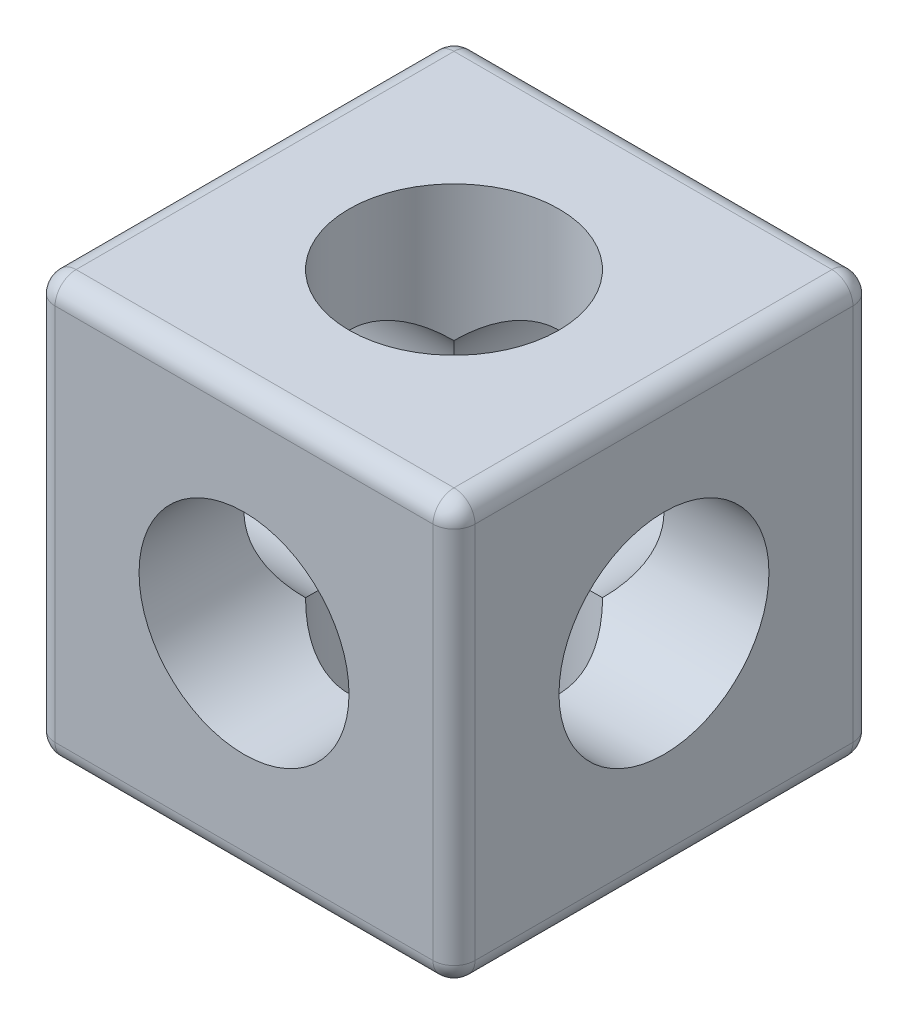
ISO-10303-21;
HEADER;
FILE_DESCRIPTION(('STEP AP214'),'2;1');
FILE_NAME('part.step','',(''),(''),'','','');
FILE_SCHEMA(('AUTOMOTIVE_DESIGN { 1 0 10303 214 1 1 1 1 }'));
ENDSEC;
DATA;
#1=APPLICATION_CONTEXT('core data for automotive mechanical design processes');
#2=APPLICATION_PROTOCOL_DEFINITION('international standard','automotive_design',2000,#1);
#3=PRODUCT_CONTEXT('',#1,'mechanical');
#4=PRODUCT('Part','Part','',(#3));
#5=PRODUCT_RELATED_PRODUCT_CATEGORY('part','',(#4));
#6=PRODUCT_DEFINITION_FORMATION('','',#4);
#7=PRODUCT_DEFINITION_CONTEXT('part definition',#1,'design');
#8=PRODUCT_DEFINITION('design','',#6,#7);
#9=PRODUCT_DEFINITION_SHAPE('','',#8);
#10=(LENGTH_UNIT() NAMED_UNIT(*) SI_UNIT(.MILLI.,.METRE.));
#11=(NAMED_UNIT(*) PLANE_ANGLE_UNIT() SI_UNIT($,.RADIAN.));
#12=(NAMED_UNIT(*) SI_UNIT($,.STERADIAN.) SOLID_ANGLE_UNIT());
#13=UNCERTAINTY_MEASURE_WITH_UNIT(LENGTH_MEASURE(1.E-05),#10,'distance_accuracy_value','');
#14=(GEOMETRIC_REPRESENTATION_CONTEXT(3) GLOBAL_UNCERTAINTY_ASSIGNED_CONTEXT((#13)) GLOBAL_UNIT_ASSIGNED_CONTEXT((#10,
#11,#12)) REPRESENTATION_CONTEXT('',''));
#15=CARTESIAN_POINT('',(0.,0.,0.));
#16=DIRECTION('',(0.,0.,1.));
#17=DIRECTION('',(1.,0.,0.));
#18=AXIS2_PLACEMENT_3D('',#15,#16,#17);
#19=CARTESIAN_POINT('',(0.,-2.001,2.));
#20=DIRECTION('',(0.,1.,0.));
#21=DIRECTION('',(-1.,0.,0.));
#22=AXIS2_PLACEMENT_3D('',#19,#20,#21);
#23=CYLINDRICAL_SURFACE('',#22,1.);
#24=CARTESIAN_POINT('',(0.,2.,2.));
#25=DIRECTION('',(0.,1.,0.));
#26=DIRECTION('',(-1.,0.,0.));
#27=AXIS2_PLACEMENT_3D('',#24,#25,#26);
#28=CIRCLE('',#27,1.);
#29=CARTESIAN_POINT('',(-1.,2.,2.));
#30=VERTEX_POINT('',#29);
#31=EDGE_CURVE('E322',#30,#30,#28,.T.);
#32=ORIENTED_EDGE('',*,*,#31,.T.);
#33=EDGE_LOOP('',(#32));
#34=FACE_BOUND('',#33,.T.);
#35=CARTESIAN_POINT('',(0.,0.,2.));
#36=DIRECTION('',(0.,0.707106781186547,-0.707106781186547));
#37=DIRECTION('',(0.,0.707106781186547,0.707106781186547));
#38=AXIS2_PLACEMENT_3D('',#35,#36,#37);
#39=ELLIPSE('',#38,1.41421356237309,1.);
#40=CARTESIAN_POINT('',(0.707106781186548,0.707106781186547,2.70710678118655));
#41=VERTEX_POINT('',#40);
#42=CARTESIAN_POINT('',(-0.707106781186547,0.707106781186547,2.70710678118655));
#43=VERTEX_POINT('',#42);
#44=EDGE_CURVE('E167',#41,#43,#39,.F.);
#45=ORIENTED_EDGE('',*,*,#44,.T.);
#46=CARTESIAN_POINT('',(0.,0.,2.));
#47=DIRECTION('',(0.707106781186547,0.707106781186548,0.));
#48=DIRECTION('',(-0.707106781186548,0.707106781186547,0.));
#49=AXIS2_PLACEMENT_3D('',#46,#47,#48);
#50=ELLIPSE('',#49,1.4142135623731,1.);
#51=CARTESIAN_POINT('',(-0.707106781186547,0.707106781186547,1.29289321881345));
#52=VERTEX_POINT('',#51);
#53=EDGE_CURVE('E151',#43,#52,#50,.F.);
#54=ORIENTED_EDGE('',*,*,#53,.T.);
#55=CARTESIAN_POINT('',(0.,0.,2.));
#56=DIRECTION('',(0.,0.707106781186547,0.707106781186547));
#57=DIRECTION('',(0.,0.707106781186547,-0.707106781186547));
#58=AXIS2_PLACEMENT_3D('',#55,#56,#57);
#59=ELLIPSE('',#58,1.41421356237309,1.);
#60=CARTESIAN_POINT('',(0.707106781186548,0.707106781186547,1.29289321881345));
#61=VERTEX_POINT('',#60);
#62=EDGE_CURVE('E160',#52,#61,#59,.F.);
#63=ORIENTED_EDGE('',*,*,#62,.T.);
#64=CARTESIAN_POINT('',(0.,0.,2.));
#65=DIRECTION('',(-0.707106781186548,0.707106781186547,0.));
#66=DIRECTION('',(0.707106781186547,0.707106781186548,0.));
#67=AXIS2_PLACEMENT_3D('',#64,#65,#66);
#68=ELLIPSE('',#67,1.41421356237309,1.);
#69=EDGE_CURVE('E313',#61,#41,#68,.F.);
#70=ORIENTED_EDGE('',*,*,#69,.T.);
#71=EDGE_LOOP('',(#45,#54,#63,#70));
#72=FACE_BOUND('',#71,.T.);
#73=ADVANCED_FACE('F33',(#34,#72),#23,.F.);
#74=CARTESIAN_POINT('',(-2.,2.,4.));
#75=DIRECTION('',(1.,0.,0.));
#76=DIRECTION('',(0.,0.,-1.));
#77=AXIS2_PLACEMENT_3D('',#74,#75,#76);
#78=PLANE('',#77);
#79=DIRECTION('',(0.,0.,-1.));
#80=VECTOR('',#79,1.);
#81=CARTESIAN_POINT('',(-2.,-1.8,4.));
#82=LINE('',#81,#80);
#83=CARTESIAN_POINT('',(-2.,-1.8,0.2));
#84=VERTEX_POINT('',#83);
#85=CARTESIAN_POINT('',(-2.,-1.8,3.8));
#86=VERTEX_POINT('',#85);
#87=EDGE_CURVE('E220',#84,#86,#82,.F.);
#88=ORIENTED_EDGE('',*,*,#87,.T.);
#89=DIRECTION('',(0.,-1.,0.));
#90=VECTOR('',#89,1.);
#91=CARTESIAN_POINT('',(-2.,2.,3.8));
#92=LINE('',#91,#90);
#93=CARTESIAN_POINT('',(-2.,1.8,3.8));
#94=VERTEX_POINT('',#93);
#95=EDGE_CURVE('E222',#86,#94,#92,.F.);
#96=ORIENTED_EDGE('',*,*,#95,.T.);
#97=DIRECTION('',(0.,0.,-1.));
#98=VECTOR('',#97,1.);
#99=CARTESIAN_POINT('',(-2.,1.8,4.));
#100=LINE('',#99,#98);
#101=CARTESIAN_POINT('',(-2.,1.8,0.2));
#102=VERTEX_POINT('',#101);
#103=EDGE_CURVE('E216',#94,#102,#100,.T.);
#104=ORIENTED_EDGE('',*,*,#103,.T.);
#105=DIRECTION('',(0.,-1.,0.));
#106=VECTOR('',#105,1.);
#107=CARTESIAN_POINT('',(-2.,-2.,0.2));
#108=LINE('',#107,#106);
#109=EDGE_CURVE('E218',#102,#84,#108,.T.);
#110=ORIENTED_EDGE('',*,*,#109,.T.);
#111=EDGE_LOOP('',(#88,#96,#104,#110));
#112=FACE_BOUND('',#111,.T.);
#113=CARTESIAN_POINT('',(-2.,0.,2.));
#114=DIRECTION('',(1.,0.,0.));
#115=DIRECTION('',(0.,0.,-1.));
#116=AXIS2_PLACEMENT_3D('',#113,#114,#115);
#117=CIRCLE('',#116,1.);
#118=CARTESIAN_POINT('',(-2.,0.,1.));
#119=VERTEX_POINT('',#118);
#120=EDGE_CURVE('E301',#119,#119,#117,.T.);
#121=ORIENTED_EDGE('',*,*,#120,.T.);
#122=EDGE_LOOP('',(#121));
#123=FACE_BOUND('',#122,.T.);
#124=ADVANCED_FACE('F350',(#112,#123),#78,.F.);
#125=CARTESIAN_POINT('',(2.,-2.,4.));
#126=DIRECTION('',(0.,1.,0.));
#127=DIRECTION('',(-1.,0.,0.));
#128=AXIS2_PLACEMENT_3D('',#125,#126,#127);
#129=PLANE('',#128);
#130=DIRECTION('',(0.,0.,-1.));
#131=VECTOR('',#130,1.);
#132=CARTESIAN_POINT('',(1.8,-2.,4.));
#133=LINE('',#132,#131);
#134=CARTESIAN_POINT('',(1.8,-2.,0.2));
#135=VERTEX_POINT('',#134);
#136=CARTESIAN_POINT('',(1.8,-2.,3.8));
#137=VERTEX_POINT('',#136);
#138=EDGE_CURVE('E193',#135,#137,#133,.F.);
#139=ORIENTED_EDGE('',*,*,#138,.T.);
#140=DIRECTION('',(1.,0.,0.));
#141=VECTOR('',#140,1.);
#142=CARTESIAN_POINT('',(2.,-2.,3.8));
#143=LINE('',#142,#141);
#144=CARTESIAN_POINT('',(-1.8,-2.,3.8));
#145=VERTEX_POINT('',#144);
#146=EDGE_CURVE('E195',#137,#145,#143,.F.);
#147=ORIENTED_EDGE('',*,*,#146,.T.);
#148=DIRECTION('',(0.,0.,-1.));
#149=VECTOR('',#148,1.);
#150=CARTESIAN_POINT('',(-1.8,-2.,4.));
#151=LINE('',#150,#149);
#152=CARTESIAN_POINT('',(-1.8,-2.,0.2));
#153=VERTEX_POINT('',#152);
#154=EDGE_CURVE('E189',#145,#153,#151,.T.);
#155=ORIENTED_EDGE('',*,*,#154,.T.);
#156=DIRECTION('',(1.,0.,0.));
#157=VECTOR('',#156,1.);
#158=CARTESIAN_POINT('',(2.,-2.,0.2));
#159=LINE('',#158,#157);
#160=EDGE_CURVE('E191',#153,#135,#159,.T.);
#161=ORIENTED_EDGE('',*,*,#160,.T.);
#162=EDGE_LOOP('',(#139,#147,#155,#161));
#163=FACE_BOUND('',#162,.T.);
#164=CARTESIAN_POINT('',(0.,-2.,2.));
#165=DIRECTION('',(0.,1.,0.));
#166=DIRECTION('',(-1.,0.,0.));
#167=AXIS2_PLACEMENT_3D('',#164,#165,#166);
#168=CIRCLE('',#167,1.);
#169=CARTESIAN_POINT('',(-0.999999999999999,-2.,2.));
#170=VERTEX_POINT('',#169);
#171=EDGE_CURVE('E327',#170,#170,#168,.F.);
#172=ORIENTED_EDGE('',*,*,#171,.F.);
#173=EDGE_LOOP('',(#172));
#174=FACE_BOUND('',#173,.T.);
#175=ADVANCED_FACE('F355',(#163,#174),#129,.F.);
#176=CARTESIAN_POINT('',(2.,2.,4.));
#177=DIRECTION('',(-1.,0.,0.));
#178=DIRECTION('',(0.,0.,1.));
#179=AXIS2_PLACEMENT_3D('',#176,#177,#178);
#180=PLANE('',#179);
#181=DIRECTION('',(0.,0.,-1.));
#182=VECTOR('',#181,1.);
#183=CARTESIAN_POINT('',(2.,1.8,4.));
#184=LINE('',#183,#182);
#185=CARTESIAN_POINT('',(2.,1.8,0.2));
#186=VERTEX_POINT('',#185);
#187=CARTESIAN_POINT('',(2.,1.8,3.8));
#188=VERTEX_POINT('',#187);
#189=EDGE_CURVE('E200',#186,#188,#184,.F.);
#190=ORIENTED_EDGE('',*,*,#189,.T.);
#191=DIRECTION('',(0.,1.,0.));
#192=VECTOR('',#191,1.);
#193=CARTESIAN_POINT('',(2.,2.,3.8));
#194=LINE('',#193,#192);
#195=CARTESIAN_POINT('',(2.,-1.8,3.8));
#196=VERTEX_POINT('',#195);
#197=EDGE_CURVE('E204',#188,#196,#194,.F.);
#198=ORIENTED_EDGE('',*,*,#197,.T.);
#199=DIRECTION('',(0.,0.,-1.));
#200=VECTOR('',#199,1.);
#201=CARTESIAN_POINT('',(2.,-1.8,4.));
#202=LINE('',#201,#200);
#203=CARTESIAN_POINT('',(2.,-1.8,0.2));
#204=VERTEX_POINT('',#203);
#205=EDGE_CURVE('E202',#196,#204,#202,.T.);
#206=ORIENTED_EDGE('',*,*,#205,.T.);
#207=DIRECTION('',(0.,1.,0.));
#208=VECTOR('',#207,1.);
#209=CARTESIAN_POINT('',(2.,2.,0.2));
#210=LINE('',#209,#208);
#211=EDGE_CURVE('E198',#204,#186,#210,.T.);
#212=ORIENTED_EDGE('',*,*,#211,.T.);
#213=EDGE_LOOP('',(#190,#198,#206,#212));
#214=FACE_BOUND('',#213,.T.);
#215=CARTESIAN_POINT('',(2.,0.,2.));
#216=DIRECTION('',(1.,0.,0.));
#217=DIRECTION('',(0.,0.,-1.));
#218=AXIS2_PLACEMENT_3D('',#215,#216,#217);
#219=CIRCLE('',#218,1.);
#220=CARTESIAN_POINT('',(2.,0.,1.));
#221=VERTEX_POINT('',#220);
#222=EDGE_CURVE('E295',#221,#221,#219,.T.);
#223=ORIENTED_EDGE('',*,*,#222,.F.);
#224=EDGE_LOOP('',(#223));
#225=FACE_BOUND('',#224,.T.);
#226=ADVANCED_FACE('F368',(#214,#225),#180,.F.);
#227=CARTESIAN_POINT('',(2.,2.,4.));
#228=DIRECTION('',(0.,-1.,0.));
#229=DIRECTION('',(1.,0.,0.));
#230=AXIS2_PLACEMENT_3D('',#227,#228,#229);
#231=PLANE('',#230);
#232=DIRECTION('',(-1.,0.,0.));
#233=VECTOR('',#232,1.);
#234=CARTESIAN_POINT('',(2.,2.,3.8));
#235=LINE('',#234,#233);
#236=CARTESIAN_POINT('',(-1.8,2.,3.8));
#237=VERTEX_POINT('',#236);
#238=CARTESIAN_POINT('',(1.8,2.,3.8));
#239=VERTEX_POINT('',#238);
#240=EDGE_CURVE('E211',#237,#239,#235,.F.);
#241=ORIENTED_EDGE('',*,*,#240,.T.);
#242=DIRECTION('',(0.,0.,-1.));
#243=VECTOR('',#242,1.);
#244=CARTESIAN_POINT('',(1.8,2.,4.));
#245=LINE('',#244,#243);
#246=CARTESIAN_POINT('',(1.8,2.,0.2));
#247=VERTEX_POINT('',#246);
#248=EDGE_CURVE('E213',#239,#247,#245,.T.);
#249=ORIENTED_EDGE('',*,*,#248,.T.);
#250=DIRECTION('',(-1.,0.,0.));
#251=VECTOR('',#250,1.);
#252=CARTESIAN_POINT('',(-2.,2.,0.2));
#253=LINE('',#252,#251);
#254=CARTESIAN_POINT('',(-1.8,2.,0.2));
#255=VERTEX_POINT('',#254);
#256=EDGE_CURVE('E207',#247,#255,#253,.T.);
#257=ORIENTED_EDGE('',*,*,#256,.T.);
#258=DIRECTION('',(0.,0.,-1.));
#259=VECTOR('',#258,1.);
#260=CARTESIAN_POINT('',(-1.8,2.,4.));
#261=LINE('',#260,#259);
#262=EDGE_CURVE('E209',#255,#237,#261,.F.);
#263=ORIENTED_EDGE('',*,*,#262,.T.);
#264=EDGE_LOOP('',(#241,#249,#257,#263));
#265=FACE_BOUND('',#264,.T.);
#266=ORIENTED_EDGE('',*,*,#31,.F.);
#267=EDGE_LOOP('',(#266));
#268=FACE_BOUND('',#267,.T.);
#269=ADVANCED_FACE('F362',(#265,#268),#231,.F.);
#270=CARTESIAN_POINT('',(0.,0.,4.));
#271=DIRECTION('',(0.,0.,-1.));
#272=DIRECTION('',(-1.,0.,0.));
#273=AXIS2_PLACEMENT_3D('',#270,#271,#272);
#274=PLANE('',#273);
#275=DIRECTION('',(0.,-1.,0.));
#276=VECTOR('',#275,1.);
#277=CARTESIAN_POINT('',(-1.8,0.,4.));
#278=LINE('',#277,#276);
#279=CARTESIAN_POINT('',(-1.8,1.8,4.));
#280=VERTEX_POINT('',#279);
#281=CARTESIAN_POINT('',(-1.8,-1.8,4.));
#282=VERTEX_POINT('',#281);
#283=EDGE_CURVE('E180',#280,#282,#278,.T.);
#284=ORIENTED_EDGE('',*,*,#283,.T.);
#285=DIRECTION('',(1.,0.,0.));
#286=VECTOR('',#285,1.);
#287=CARTESIAN_POINT('',(0.,-1.8,4.));
#288=LINE('',#287,#286);
#289=CARTESIAN_POINT('',(1.8,-1.8,4.));
#290=VERTEX_POINT('',#289);
#291=EDGE_CURVE('E186',#282,#290,#288,.T.);
#292=ORIENTED_EDGE('',*,*,#291,.T.);
#293=DIRECTION('',(0.,1.,0.));
#294=VECTOR('',#293,1.);
#295=CARTESIAN_POINT('',(1.8,0.,4.));
#296=LINE('',#295,#294);
#297=CARTESIAN_POINT('',(1.8,1.8,4.));
#298=VERTEX_POINT('',#297);
#299=EDGE_CURVE('E184',#290,#298,#296,.T.);
#300=ORIENTED_EDGE('',*,*,#299,.T.);
#301=DIRECTION('',(-1.,0.,0.));
#302=VECTOR('',#301,1.);
#303=CARTESIAN_POINT('',(0.,1.8,4.));
#304=LINE('',#303,#302);
#305=EDGE_CURVE('E182',#298,#280,#304,.T.);
#306=ORIENTED_EDGE('',*,*,#305,.T.);
#307=EDGE_LOOP('',(#284,#292,#300,#306));
#308=FACE_BOUND('',#307,.T.);
#309=CARTESIAN_POINT('',(0.,0.,4.));
#310=DIRECTION('',(0.,0.,1.));
#311=DIRECTION('',(1.,0.,0.));
#312=AXIS2_PLACEMENT_3D('',#309,#310,#311);
#313=CIRCLE('',#312,1.);
#314=CARTESIAN_POINT('',(1.,0.,4.));
#315=VERTEX_POINT('',#314);
#316=EDGE_CURVE('E318',#315,#315,#313,.T.);
#317=ORIENTED_EDGE('',*,*,#316,.F.);
#318=EDGE_LOOP('',(#317));
#319=FACE_BOUND('',#318,.T.);
#320=ADVANCED_FACE('F359',(#308,#319),#274,.F.);
#321=CARTESIAN_POINT('',(0.,0.,0.));
#322=DIRECTION('',(0.,0.,-1.));
#323=DIRECTION('',(-1.,0.,0.));
#324=AXIS2_PLACEMENT_3D('',#321,#322,#323);
#325=PLANE('',#324);
#326=DIRECTION('',(-1.,0.,0.));
#327=VECTOR('',#326,1.);
#328=CARTESIAN_POINT('',(2.,1.8,0.));
#329=LINE('',#328,#327);
#330=CARTESIAN_POINT('',(-1.8,1.8,0.));
#331=VERTEX_POINT('',#330);
#332=CARTESIAN_POINT('',(1.8,1.8,0.));
#333=VERTEX_POINT('',#332);
#334=EDGE_CURVE('E225',#331,#333,#329,.F.);
#335=ORIENTED_EDGE('',*,*,#334,.T.);
#336=DIRECTION('',(0.,1.,0.));
#337=VECTOR('',#336,1.);
#338=CARTESIAN_POINT('',(1.8,-2.,0.));
#339=LINE('',#338,#337);
#340=CARTESIAN_POINT('',(1.8,-1.8,0.));
#341=VERTEX_POINT('',#340);
#342=EDGE_CURVE('E11',#333,#341,#339,.F.);
#343=ORIENTED_EDGE('',*,*,#342,.T.);
#344=DIRECTION('',(1.,0.,0.));
#345=VECTOR('',#344,1.);
#346=CARTESIAN_POINT('',(-2.,-1.8,0.));
#347=LINE('',#346,#345);
#348=CARTESIAN_POINT('',(-1.8,-1.8,0.));
#349=VERTEX_POINT('',#348);
#350=EDGE_CURVE('E42',#341,#349,#347,.F.);
#351=ORIENTED_EDGE('',*,*,#350,.T.);
#352=DIRECTION('',(0.,-1.,0.));
#353=VECTOR('',#352,1.);
#354=CARTESIAN_POINT('',(-1.8,2.,0.));
#355=LINE('',#354,#353);
#356=EDGE_CURVE('E227',#349,#331,#355,.F.);
#357=ORIENTED_EDGE('',*,*,#356,.T.);
#358=EDGE_LOOP('',(#335,#343,#351,#357));
#359=FACE_BOUND('',#358,.T.);
#360=CARTESIAN_POINT('',(0.,0.,0.));
#361=DIRECTION('',(0.,0.,1.));
#362=DIRECTION('',(1.,0.,0.));
#363=AXIS2_PLACEMENT_3D('',#360,#361,#362);
#364=CIRCLE('',#363,1.);
#365=CARTESIAN_POINT('',(1.,0.,0.));
#366=VERTEX_POINT('',#365);
#367=EDGE_CURVE('E319',#366,#366,#364,.T.);
#368=ORIENTED_EDGE('',*,*,#367,.T.);
#369=EDGE_LOOP('',(#368));
#370=FACE_BOUND('',#369,.T.);
#371=ADVANCED_FACE('F346',(#359,#370),#325,.T.);
#372=CARTESIAN_POINT('',(0.,0.,2.));
#373=DIRECTION('',(0.,0.707106781186547,0.707106781186547));
#374=DIRECTION('',(0.,0.707106781186547,-0.707106781186547));
#375=AXIS2_PLACEMENT_3D('',#372,#373,#374);
#376=ELLIPSE('',#375,1.41421356237309,1.);
#377=CARTESIAN_POINT('',(-0.707106781186547,-0.707106781186548,2.70710678118655));
#378=VERTEX_POINT('',#377);
#379=CARTESIAN_POINT('',(0.707106781186548,-0.707106781186547,2.70710678118655));
#380=VERTEX_POINT('',#379);
#381=EDGE_CURVE('E172',#378,#380,#376,.T.);
#382=ORIENTED_EDGE('',*,*,#381,.T.);
#383=CARTESIAN_POINT('',(0.,0.,2.));
#384=DIRECTION('',(0.707106781186547,0.707106781186548,0.));
#385=DIRECTION('',(-0.707106781186548,0.707106781186547,0.));
#386=AXIS2_PLACEMENT_3D('',#383,#384,#385);
#387=ELLIPSE('',#386,1.4142135623731,1.);
#388=CARTESIAN_POINT('',(0.707106781186548,-0.707106781186547,1.29289321881345));
#389=VERTEX_POINT('',#388);
#390=EDGE_CURVE('E310',#380,#389,#387,.T.);
#391=ORIENTED_EDGE('',*,*,#390,.T.);
#392=CARTESIAN_POINT('',(0.,0.,2.));
#393=DIRECTION('',(0.,0.707106781186547,-0.707106781186547));
#394=DIRECTION('',(0.,0.707106781186547,0.707106781186547));
#395=AXIS2_PLACEMENT_3D('',#392,#393,#394);
#396=ELLIPSE('',#395,1.41421356237309,1.);
#397=CARTESIAN_POINT('',(-0.707106781186547,-0.707106781186547,1.29289321881345));
#398=VERTEX_POINT('',#397);
#399=EDGE_CURVE('E175',#389,#398,#396,.T.);
#400=ORIENTED_EDGE('',*,*,#399,.T.);
#401=CARTESIAN_POINT('',(0.,0.,2.));
#402=DIRECTION('',(-0.707106781186548,0.707106781186547,0.));
#403=DIRECTION('',(0.707106781186547,0.707106781186548,0.));
#404=AXIS2_PLACEMENT_3D('',#401,#402,#403);
#405=ELLIPSE('',#404,1.41421356237309,1.);
#406=EDGE_CURVE('E154',#398,#378,#405,.T.);
#407=ORIENTED_EDGE('',*,*,#406,.T.);
#408=EDGE_LOOP('',(#382,#391,#400,#407));
#409=FACE_BOUND('',#408,.T.);
#410=ORIENTED_EDGE('',*,*,#171,.T.);
#411=EDGE_LOOP('',(#410));
#412=FACE_BOUND('',#411,.T.);
#413=ADVANCED_FACE('F331',(#409,#412),#23,.F.);
#414=CARTESIAN_POINT('',(0.,0.,0.));
#415=DIRECTION('',(0.,0.,1.));
#416=DIRECTION('',(1.,0.,0.));
#417=AXIS2_PLACEMENT_3D('',#414,#415,#416);
#418=CYLINDRICAL_SURFACE('',#417,1.);
#419=ORIENTED_EDGE('',*,*,#316,.T.);
#420=EDGE_LOOP('',(#419));
#421=FACE_BOUND('',#420,.T.);
#422=ORIENTED_EDGE('',*,*,#381,.F.);
#423=CARTESIAN_POINT('',(0.,0.,2.));
#424=DIRECTION('',(0.707106781186547,0.,0.707106781186547));
#425=DIRECTION('',(-0.707106781186547,0.,0.707106781186547));
#426=AXIS2_PLACEMENT_3D('',#423,#424,#425);
#427=ELLIPSE('',#426,1.41421356237309,1.);
#428=EDGE_CURVE('E168',#378,#43,#427,.F.);
#429=ORIENTED_EDGE('',*,*,#428,.T.);
#430=ORIENTED_EDGE('',*,*,#44,.F.);
#431=CARTESIAN_POINT('',(0.,0.,2.));
#432=DIRECTION('',(-0.707106781186547,0.,0.707106781186547));
#433=DIRECTION('',(0.707106781186547,0.,0.707106781186547));
#434=AXIS2_PLACEMENT_3D('',#431,#432,#433);
#435=ELLIPSE('',#434,1.41421356237309,1.);
#436=EDGE_CURVE('E315',#41,#380,#435,.F.);
#437=ORIENTED_EDGE('',*,*,#436,.T.);
#438=EDGE_LOOP('',(#422,#429,#430,#437));
#439=FACE_BOUND('',#438,.T.);
#440=ADVANCED_FACE('F337',(#421,#439),#418,.F.);
#441=ORIENTED_EDGE('',*,*,#367,.F.);
#442=EDGE_LOOP('',(#441));
#443=FACE_BOUND('',#442,.T.);
#444=ORIENTED_EDGE('',*,*,#399,.F.);
#445=CARTESIAN_POINT('',(0.,0.,2.));
#446=DIRECTION('',(0.707106781186547,0.,0.707106781186547));
#447=DIRECTION('',(-0.707106781186547,0.,0.707106781186547));
#448=AXIS2_PLACEMENT_3D('',#445,#446,#447);
#449=ELLIPSE('',#448,1.41421356237309,1.);
#450=EDGE_CURVE('E159',#389,#61,#449,.T.);
#451=ORIENTED_EDGE('',*,*,#450,.T.);
#452=ORIENTED_EDGE('',*,*,#62,.F.);
#453=CARTESIAN_POINT('',(0.,0.,2.));
#454=DIRECTION('',(-0.707106781186547,0.,0.707106781186547));
#455=DIRECTION('',(0.707106781186547,0.,0.707106781186547));
#456=AXIS2_PLACEMENT_3D('',#453,#454,#455);
#457=ELLIPSE('',#456,1.41421356237309,1.);
#458=EDGE_CURVE('E148',#52,#398,#457,.T.);
#459=ORIENTED_EDGE('',*,*,#458,.T.);
#460=EDGE_LOOP('',(#444,#451,#452,#459));
#461=FACE_BOUND('',#460,.T.);
#462=ADVANCED_FACE('F171',(#443,#461),#418,.F.);
#463=CARTESIAN_POINT('',(-2.,0.,2.));
#464=DIRECTION('',(1.,0.,0.));
#465=DIRECTION('',(0.,0.,-1.));
#466=AXIS2_PLACEMENT_3D('',#463,#464,#465);
#467=CYLINDRICAL_SURFACE('',#466,1.);
#468=ORIENTED_EDGE('',*,*,#120,.F.);
#469=EDGE_LOOP('',(#468));
#470=FACE_BOUND('',#469,.T.);
#471=ORIENTED_EDGE('',*,*,#406,.F.);
#472=ORIENTED_EDGE('',*,*,#458,.F.);
#473=ORIENTED_EDGE('',*,*,#53,.F.);
#474=ORIENTED_EDGE('',*,*,#428,.F.);
#475=EDGE_LOOP('',(#471,#472,#473,#474));
#476=FACE_BOUND('',#475,.T.);
#477=ADVANCED_FACE('F150',(#470,#476),#467,.F.);
#478=ORIENTED_EDGE('',*,*,#222,.T.);
#479=EDGE_LOOP('',(#478));
#480=FACE_BOUND('',#479,.T.);
#481=ORIENTED_EDGE('',*,*,#69,.F.);
#482=ORIENTED_EDGE('',*,*,#450,.F.);
#483=ORIENTED_EDGE('',*,*,#390,.F.);
#484=ORIENTED_EDGE('',*,*,#436,.F.);
#485=EDGE_LOOP('',(#481,#482,#483,#484));
#486=FACE_BOUND('',#485,.T.);
#487=ADVANCED_FACE('F335',(#480,#486),#467,.F.);
#488=CARTESIAN_POINT('',(2.,1.8,0.2));
#489=DIRECTION('',(1.,0.,0.));
#490=DIRECTION('',(0.,1.,0.));
#491=AXIS2_PLACEMENT_3D('',#488,#489,#490);
#492=CYLINDRICAL_SURFACE('',#491,0.2);
#493=CARTESIAN_POINT('',(-1.8,1.8,0.2));
#494=DIRECTION('',(-1.,0.,0.));
#495=DIRECTION('',(0.,0.,1.));
#496=AXIS2_PLACEMENT_3D('',#493,#494,#495);
#497=CIRCLE('',#496,0.2);
#498=EDGE_CURVE('E37',#255,#331,#497,.T.);
#499=ORIENTED_EDGE('',*,*,#498,.F.);
#500=ORIENTED_EDGE('',*,*,#256,.F.);
#501=CARTESIAN_POINT('',(1.8,1.8,0.2));
#502=DIRECTION('',(1.,0.,0.));
#503=DIRECTION('',(0.,0.,-1.));
#504=AXIS2_PLACEMENT_3D('',#501,#502,#503);
#505=CIRCLE('',#504,0.2);
#506=EDGE_CURVE('E287',#333,#247,#505,.T.);
#507=ORIENTED_EDGE('',*,*,#506,.F.);
#508=ORIENTED_EDGE('',*,*,#334,.F.);
#509=EDGE_LOOP('',(#499,#500,#507,#508));
#510=FACE_BOUND('',#509,.T.);
#511=ADVANCED_FACE('F35',(#510),#492,.T.);
#512=CARTESIAN_POINT('',(-1.8,1.8,0.2));
#513=DIRECTION('',(0.,0.,1.));
#514=DIRECTION('',(1.,0.,0.));
#515=AXIS2_PLACEMENT_3D('',#512,#513,#514);
#516=SPHERICAL_SURFACE('',#515,0.2);
#517=CARTESIAN_POINT('',(-1.8,1.8,0.2));
#518=DIRECTION('',(0.,0.,-1.));
#519=DIRECTION('',(-1.,0.,0.));
#520=AXIS2_PLACEMENT_3D('',#517,#518,#519);
#521=CIRCLE('',#520,0.2);
#522=EDGE_CURVE('E282',#255,#102,#521,.F.);
#523=ORIENTED_EDGE('',*,*,#522,.F.);
#524=ORIENTED_EDGE('',*,*,#498,.T.);
#525=CARTESIAN_POINT('',(-1.8,1.8,0.2));
#526=DIRECTION('',(0.,1.,0.));
#527=DIRECTION('',(0.,0.,1.));
#528=AXIS2_PLACEMENT_3D('',#525,#526,#527);
#529=CIRCLE('',#528,0.2);
#530=EDGE_CURVE('E285',#102,#331,#529,.F.);
#531=ORIENTED_EDGE('',*,*,#530,.F.);
#532=EDGE_LOOP('',(#523,#524,#531));
#533=FACE_BOUND('',#532,.T.);
#534=ADVANCED_FACE('F445',(#533),#516,.T.);
#535=CARTESIAN_POINT('',(1.8,1.8,0.2));
#536=DIRECTION('',(0.,0.,1.));
#537=DIRECTION('',(1.,0.,0.));
#538=AXIS2_PLACEMENT_3D('',#535,#536,#537);
#539=SPHERICAL_SURFACE('',#538,0.2);
#540=CARTESIAN_POINT('',(1.8,1.8,0.2));
#541=DIRECTION('',(0.,1.,0.));
#542=DIRECTION('',(0.,0.,1.));
#543=AXIS2_PLACEMENT_3D('',#540,#541,#542);
#544=CIRCLE('',#543,0.2);
#545=EDGE_CURVE('E277',#333,#186,#544,.F.);
#546=ORIENTED_EDGE('',*,*,#545,.F.);
#547=ORIENTED_EDGE('',*,*,#506,.T.);
#548=CARTESIAN_POINT('',(1.8,1.8,0.2));
#549=DIRECTION('',(0.,0.,-1.));
#550=DIRECTION('',(-1.,0.,0.));
#551=AXIS2_PLACEMENT_3D('',#548,#549,#550);
#552=CIRCLE('',#551,0.2);
#553=EDGE_CURVE('E280',#186,#247,#552,.F.);
#554=ORIENTED_EDGE('',*,*,#553,.F.);
#555=EDGE_LOOP('',(#546,#547,#554));
#556=FACE_BOUND('',#555,.T.);
#557=ADVANCED_FACE('F442',(#556),#539,.T.);
#558=CARTESIAN_POINT('',(-1.8,2.,0.2));
#559=DIRECTION('',(0.,1.,0.));
#560=DIRECTION('',(0.,0.,1.));
#561=AXIS2_PLACEMENT_3D('',#558,#559,#560);
#562=CYLINDRICAL_SURFACE('',#561,0.2);
#563=ORIENTED_EDGE('',*,*,#530,.T.);
#564=ORIENTED_EDGE('',*,*,#356,.F.);
#565=CARTESIAN_POINT('',(-1.8,-1.8,0.2));
#566=DIRECTION('',(0.,-1.,0.));
#567=DIRECTION('',(0.,0.,-1.));
#568=AXIS2_PLACEMENT_3D('',#565,#566,#567);
#569=CIRCLE('',#568,0.2);
#570=EDGE_CURVE('E271',#84,#349,#569,.T.);
#571=ORIENTED_EDGE('',*,*,#570,.F.);
#572=ORIENTED_EDGE('',*,*,#109,.F.);
#573=EDGE_LOOP('',(#563,#564,#571,#572));
#574=FACE_BOUND('',#573,.T.);
#575=ADVANCED_FACE('F438',(#574),#562,.T.);
#576=CARTESIAN_POINT('',(-1.8,1.8,4.));
#577=DIRECTION('',(0.,0.,-1.));
#578=DIRECTION('',(-1.,0.,0.));
#579=AXIS2_PLACEMENT_3D('',#576,#577,#578);
#580=CYLINDRICAL_SURFACE('',#579,0.2);
#581=ORIENTED_EDGE('',*,*,#522,.T.);
#582=ORIENTED_EDGE('',*,*,#103,.F.);
#583=CARTESIAN_POINT('',(-1.8,1.8,3.8));
#584=DIRECTION('',(0.,0.,1.));
#585=DIRECTION('',(1.,0.,0.));
#586=AXIS2_PLACEMENT_3D('',#583,#584,#585);
#587=CIRCLE('',#586,0.2);
#588=EDGE_CURVE('E268',#237,#94,#587,.T.);
#589=ORIENTED_EDGE('',*,*,#588,.F.);
#590=ORIENTED_EDGE('',*,*,#262,.F.);
#591=EDGE_LOOP('',(#581,#582,#589,#590));
#592=FACE_BOUND('',#591,.T.);
#593=ADVANCED_FACE('F434',(#592),#580,.T.);
#594=CARTESIAN_POINT('',(0.,1.8,3.8));
#595=DIRECTION('',(-1.,0.,0.));
#596=DIRECTION('',(0.,-1.,0.));
#597=AXIS2_PLACEMENT_3D('',#594,#595,#596);
#598=CYLINDRICAL_SURFACE('',#597,0.2);
#599=CARTESIAN_POINT('',(1.8,1.8,3.8));
#600=DIRECTION('',(1.,0.,0.));
#601=DIRECTION('',(0.,0.,-1.));
#602=AXIS2_PLACEMENT_3D('',#599,#600,#601);
#603=CIRCLE('',#602,0.2);
#604=EDGE_CURVE('E262',#239,#298,#603,.T.);
#605=ORIENTED_EDGE('',*,*,#604,.F.);
#606=ORIENTED_EDGE('',*,*,#240,.F.);
#607=CARTESIAN_POINT('',(-1.8,1.8,3.8));
#608=DIRECTION('',(-1.,0.,0.));
#609=DIRECTION('',(0.,0.,1.));
#610=AXIS2_PLACEMENT_3D('',#607,#608,#609);
#611=CIRCLE('',#610,0.2);
#612=EDGE_CURVE('E265',#280,#237,#611,.T.);
#613=ORIENTED_EDGE('',*,*,#612,.F.);
#614=ORIENTED_EDGE('',*,*,#305,.F.);
#615=EDGE_LOOP('',(#605,#606,#613,#614));
#616=FACE_BOUND('',#615,.T.);
#617=ADVANCED_FACE('F430',(#616),#598,.T.);
#618=CARTESIAN_POINT('',(1.8,1.8,4.));
#619=DIRECTION('',(0.,0.,-1.));
#620=DIRECTION('',(-1.,0.,0.));
#621=AXIS2_PLACEMENT_3D('',#618,#619,#620);
#622=CYLINDRICAL_SURFACE('',#621,0.2);
#623=ORIENTED_EDGE('',*,*,#553,.T.);
#624=ORIENTED_EDGE('',*,*,#248,.F.);
#625=CARTESIAN_POINT('',(1.8,1.8,3.8));
#626=DIRECTION('',(0.,0.,1.));
#627=DIRECTION('',(1.,0.,0.));
#628=AXIS2_PLACEMENT_3D('',#625,#626,#627);
#629=CIRCLE('',#628,0.2);
#630=EDGE_CURVE('E259',#188,#239,#629,.T.);
#631=ORIENTED_EDGE('',*,*,#630,.F.);
#632=ORIENTED_EDGE('',*,*,#189,.F.);
#633=EDGE_LOOP('',(#623,#624,#631,#632));
#634=FACE_BOUND('',#633,.T.);
#635=ADVANCED_FACE('F426',(#634),#622,.T.);
#636=CARTESIAN_POINT('',(1.8,2.,0.2));
#637=DIRECTION('',(0.,-1.,0.));
#638=DIRECTION('',(0.,0.,-1.));
#639=AXIS2_PLACEMENT_3D('',#636,#637,#638);
#640=CYLINDRICAL_SURFACE('',#639,0.2);
#641=ORIENTED_EDGE('',*,*,#545,.T.);
#642=ORIENTED_EDGE('',*,*,#211,.F.);
#643=CARTESIAN_POINT('',(1.8,-1.8,0.2));
#644=DIRECTION('',(0.,-1.,0.));
#645=DIRECTION('',(0.,0.,-1.));
#646=AXIS2_PLACEMENT_3D('',#643,#644,#645);
#647=CIRCLE('',#646,0.2);
#648=EDGE_CURVE('E257',#341,#204,#647,.T.);
#649=ORIENTED_EDGE('',*,*,#648,.F.);
#650=ORIENTED_EDGE('',*,*,#342,.F.);
#651=EDGE_LOOP('',(#641,#642,#649,#650));
#652=FACE_BOUND('',#651,.T.);
#653=ADVANCED_FACE('F422',(#652),#640,.T.);
#654=CARTESIAN_POINT('',(2.,-1.8,0.2));
#655=DIRECTION('',(-1.,0.,0.));
#656=DIRECTION('',(0.,-1.,0.));
#657=AXIS2_PLACEMENT_3D('',#654,#655,#656);
#658=CYLINDRICAL_SURFACE('',#657,0.2);
#659=CARTESIAN_POINT('',(-1.8,-1.8,0.2));
#660=DIRECTION('',(-1.,0.,0.));
#661=DIRECTION('',(0.,0.,1.));
#662=AXIS2_PLACEMENT_3D('',#659,#660,#661);
#663=CIRCLE('',#662,0.2);
#664=EDGE_CURVE('E274',#349,#153,#663,.T.);
#665=ORIENTED_EDGE('',*,*,#664,.F.);
#666=ORIENTED_EDGE('',*,*,#350,.F.);
#667=CARTESIAN_POINT('',(1.8,-1.8,0.2));
#668=DIRECTION('',(1.,0.,0.));
#669=DIRECTION('',(0.,0.,-1.));
#670=AXIS2_PLACEMENT_3D('',#667,#668,#669);
#671=CIRCLE('',#670,0.2);
#672=EDGE_CURVE('E50',#135,#341,#671,.T.);
#673=ORIENTED_EDGE('',*,*,#672,.F.);
#674=ORIENTED_EDGE('',*,*,#160,.F.);
#675=EDGE_LOOP('',(#665,#666,#673,#674));
#676=FACE_BOUND('',#675,.T.);
#677=ADVANCED_FACE('F418',(#676),#658,.T.);
#678=CARTESIAN_POINT('',(-1.8,-1.8,0.2));
#679=DIRECTION('',(0.,0.,1.));
#680=DIRECTION('',(1.,0.,0.));
#681=AXIS2_PLACEMENT_3D('',#678,#679,#680);
#682=SPHERICAL_SURFACE('',#681,0.2);
#683=ORIENTED_EDGE('',*,*,#570,.T.);
#684=ORIENTED_EDGE('',*,*,#664,.T.);
#685=CARTESIAN_POINT('',(-1.8,-1.8,0.2));
#686=DIRECTION('',(0.,0.,-1.));
#687=DIRECTION('',(-1.,0.,0.));
#688=AXIS2_PLACEMENT_3D('',#685,#686,#687);
#689=CIRCLE('',#688,0.2);
#690=EDGE_CURVE('E253',#84,#153,#689,.F.);
#691=ORIENTED_EDGE('',*,*,#690,.F.);
#692=EDGE_LOOP('',(#683,#684,#691));
#693=FACE_BOUND('',#692,.T.);
#694=ADVANCED_FACE('F414',(#693),#682,.T.);
#695=CARTESIAN_POINT('',(-1.8,1.8,3.8));
#696=DIRECTION('',(0.,0.,1.));
#697=DIRECTION('',(1.,0.,0.));
#698=AXIS2_PLACEMENT_3D('',#695,#696,#697);
#699=SPHERICAL_SURFACE('',#698,0.2);
#700=ORIENTED_EDGE('',*,*,#612,.T.);
#701=ORIENTED_EDGE('',*,*,#588,.T.);
#702=CARTESIAN_POINT('',(-1.8,1.8,3.8));
#703=DIRECTION('',(0.,1.,0.));
#704=DIRECTION('',(0.,0.,1.));
#705=AXIS2_PLACEMENT_3D('',#702,#703,#704);
#706=CIRCLE('',#705,0.2);
#707=EDGE_CURVE('E251',#280,#94,#706,.F.);
#708=ORIENTED_EDGE('',*,*,#707,.F.);
#709=EDGE_LOOP('',(#700,#701,#708));
#710=FACE_BOUND('',#709,.T.);
#711=ADVANCED_FACE('F410',(#710),#699,.T.);
#712=CARTESIAN_POINT('',(1.8,1.8,3.8));
#713=DIRECTION('',(0.,0.,1.));
#714=DIRECTION('',(1.,0.,0.));
#715=AXIS2_PLACEMENT_3D('',#712,#713,#714);
#716=SPHERICAL_SURFACE('',#715,0.2);
#717=ORIENTED_EDGE('',*,*,#630,.T.);
#718=ORIENTED_EDGE('',*,*,#604,.T.);
#719=CARTESIAN_POINT('',(1.8,1.8,3.8));
#720=DIRECTION('',(0.,1.,0.));
#721=DIRECTION('',(0.,0.,1.));
#722=AXIS2_PLACEMENT_3D('',#719,#720,#721);
#723=CIRCLE('',#722,0.2);
#724=EDGE_CURVE('E248',#188,#298,#723,.F.);
#725=ORIENTED_EDGE('',*,*,#724,.F.);
#726=EDGE_LOOP('',(#717,#718,#725));
#727=FACE_BOUND('',#726,.T.);
#728=ADVANCED_FACE('F407',(#727),#716,.T.);
#729=CARTESIAN_POINT('',(1.8,-1.8,0.2));
#730=DIRECTION('',(0.,0.,1.));
#731=DIRECTION('',(1.,0.,0.));
#732=AXIS2_PLACEMENT_3D('',#729,#730,#731);
#733=SPHERICAL_SURFACE('',#732,0.2);
#734=ORIENTED_EDGE('',*,*,#672,.T.);
#735=ORIENTED_EDGE('',*,*,#648,.T.);
#736=CARTESIAN_POINT('',(1.8,-1.8,0.2));
#737=DIRECTION('',(0.,0.,-1.));
#738=DIRECTION('',(-1.,0.,0.));
#739=AXIS2_PLACEMENT_3D('',#736,#737,#738);
#740=CIRCLE('',#739,0.2);
#741=EDGE_CURVE('E245',#135,#204,#740,.F.);
#742=ORIENTED_EDGE('',*,*,#741,.F.);
#743=EDGE_LOOP('',(#734,#735,#742));
#744=FACE_BOUND('',#743,.T.);
#745=ADVANCED_FACE('F403',(#744),#733,.T.);
#746=CARTESIAN_POINT('',(-1.8,-1.8,4.));
#747=DIRECTION('',(0.,0.,-1.));
#748=DIRECTION('',(-1.,0.,0.));
#749=AXIS2_PLACEMENT_3D('',#746,#747,#748);
#750=CYLINDRICAL_SURFACE('',#749,0.2);
#751=ORIENTED_EDGE('',*,*,#690,.T.);
#752=ORIENTED_EDGE('',*,*,#154,.F.);
#753=CARTESIAN_POINT('',(-1.8,-1.8,3.8));
#754=DIRECTION('',(0.,0.,1.));
#755=DIRECTION('',(1.,0.,0.));
#756=AXIS2_PLACEMENT_3D('',#753,#754,#755);
#757=CIRCLE('',#756,0.2);
#758=EDGE_CURVE('E242',#86,#145,#757,.T.);
#759=ORIENTED_EDGE('',*,*,#758,.F.);
#760=ORIENTED_EDGE('',*,*,#87,.F.);
#761=EDGE_LOOP('',(#751,#752,#759,#760));
#762=FACE_BOUND('',#761,.T.);
#763=ADVANCED_FACE('F399',(#762),#750,.T.);
#764=CARTESIAN_POINT('',(-1.8,0.,3.8));
#765=DIRECTION('',(0.,-1.,0.));
#766=DIRECTION('',(0.,0.,-1.));
#767=AXIS2_PLACEMENT_3D('',#764,#765,#766);
#768=CYLINDRICAL_SURFACE('',#767,0.2);
#769=ORIENTED_EDGE('',*,*,#707,.T.);
#770=ORIENTED_EDGE('',*,*,#95,.F.);
#771=CARTESIAN_POINT('',(-1.8,-1.8,3.8));
#772=DIRECTION('',(0.,-1.,0.));
#773=DIRECTION('',(0.,0.,-1.));
#774=AXIS2_PLACEMENT_3D('',#771,#772,#773);
#775=CIRCLE('',#774,0.2);
#776=EDGE_CURVE('E239',#282,#86,#775,.T.);
#777=ORIENTED_EDGE('',*,*,#776,.F.);
#778=ORIENTED_EDGE('',*,*,#283,.F.);
#779=EDGE_LOOP('',(#769,#770,#777,#778));
#780=FACE_BOUND('',#779,.T.);
#781=ADVANCED_FACE('F395',(#780),#768,.T.);
#782=CARTESIAN_POINT('',(1.8,0.,3.8));
#783=DIRECTION('',(0.,1.,0.));
#784=DIRECTION('',(0.,0.,1.));
#785=AXIS2_PLACEMENT_3D('',#782,#783,#784);
#786=CYLINDRICAL_SURFACE('',#785,0.2);
#787=ORIENTED_EDGE('',*,*,#724,.T.);
#788=ORIENTED_EDGE('',*,*,#299,.F.);
#789=CARTESIAN_POINT('',(1.8,-1.8,3.8));
#790=DIRECTION('',(0.,-1.,0.));
#791=DIRECTION('',(0.,0.,-1.));
#792=AXIS2_PLACEMENT_3D('',#789,#790,#791);
#793=CIRCLE('',#792,0.2);
#794=EDGE_CURVE('E236',#196,#290,#793,.T.);
#795=ORIENTED_EDGE('',*,*,#794,.F.);
#796=ORIENTED_EDGE('',*,*,#197,.F.);
#797=EDGE_LOOP('',(#787,#788,#795,#796));
#798=FACE_BOUND('',#797,.T.);
#799=ADVANCED_FACE('F391',(#798),#786,.T.);
#800=CARTESIAN_POINT('',(1.8,-1.8,4.));
#801=DIRECTION('',(0.,0.,-1.));
#802=DIRECTION('',(-1.,0.,0.));
#803=AXIS2_PLACEMENT_3D('',#800,#801,#802);
#804=CYLINDRICAL_SURFACE('',#803,0.2);
#805=ORIENTED_EDGE('',*,*,#741,.T.);
#806=ORIENTED_EDGE('',*,*,#205,.F.);
#807=CARTESIAN_POINT('',(1.8,-1.8,3.8));
#808=DIRECTION('',(0.,0.,1.));
#809=DIRECTION('',(1.,0.,0.));
#810=AXIS2_PLACEMENT_3D('',#807,#808,#809);
#811=CIRCLE('',#810,0.2);
#812=EDGE_CURVE('E234',#137,#196,#811,.T.);
#813=ORIENTED_EDGE('',*,*,#812,.F.);
#814=ORIENTED_EDGE('',*,*,#138,.F.);
#815=EDGE_LOOP('',(#805,#806,#813,#814));
#816=FACE_BOUND('',#815,.T.);
#817=ADVANCED_FACE('F387',(#816),#804,.T.);
#818=CARTESIAN_POINT('',(-1.8,-1.8,3.8));
#819=DIRECTION('',(0.,0.,1.));
#820=DIRECTION('',(1.,0.,0.));
#821=AXIS2_PLACEMENT_3D('',#818,#819,#820);
#822=SPHERICAL_SURFACE('',#821,0.2);
#823=ORIENTED_EDGE('',*,*,#776,.T.);
#824=ORIENTED_EDGE('',*,*,#758,.T.);
#825=CARTESIAN_POINT('',(-1.8,-1.8,3.8));
#826=DIRECTION('',(-1.,0.,0.));
#827=DIRECTION('',(0.,0.,1.));
#828=AXIS2_PLACEMENT_3D('',#825,#826,#827);
#829=CIRCLE('',#828,0.2);
#830=EDGE_CURVE('E232',#282,#145,#829,.F.);
#831=ORIENTED_EDGE('',*,*,#830,.F.);
#832=EDGE_LOOP('',(#823,#824,#831));
#833=FACE_BOUND('',#832,.T.);
#834=ADVANCED_FACE('F383',(#833),#822,.T.);
#835=CARTESIAN_POINT('',(1.8,-1.8,3.8));
#836=DIRECTION('',(0.,0.,1.));
#837=DIRECTION('',(1.,0.,0.));
#838=AXIS2_PLACEMENT_3D('',#835,#836,#837);
#839=SPHERICAL_SURFACE('',#838,0.2);
#840=ORIENTED_EDGE('',*,*,#812,.T.);
#841=ORIENTED_EDGE('',*,*,#794,.T.);
#842=CARTESIAN_POINT('',(1.8,-1.8,3.8));
#843=DIRECTION('',(1.,0.,0.));
#844=DIRECTION('',(0.,0.,-1.));
#845=AXIS2_PLACEMENT_3D('',#842,#843,#844);
#846=CIRCLE('',#845,0.2);
#847=EDGE_CURVE('E230',#137,#290,#846,.F.);
#848=ORIENTED_EDGE('',*,*,#847,.F.);
#849=EDGE_LOOP('',(#840,#841,#848));
#850=FACE_BOUND('',#849,.T.);
#851=ADVANCED_FACE('F379',(#850),#839,.T.);
#852=CARTESIAN_POINT('',(0.,-1.8,3.8));
#853=DIRECTION('',(1.,0.,0.));
#854=DIRECTION('',(0.,1.,0.));
#855=AXIS2_PLACEMENT_3D('',#852,#853,#854);
#856=CYLINDRICAL_SURFACE('',#855,0.2);
#857=ORIENTED_EDGE('',*,*,#830,.T.);
#858=ORIENTED_EDGE('',*,*,#146,.F.);
#859=ORIENTED_EDGE('',*,*,#847,.T.);
#860=ORIENTED_EDGE('',*,*,#291,.F.);
#861=EDGE_LOOP('',(#857,#858,#859,#860));
#862=FACE_BOUND('',#861,.T.);
#863=ADVANCED_FACE('F376',(#862),#856,.T.);
#864=CLOSED_SHELL('',(#73,#124,#175,#226,#269,#320,#371,#413,#440,#462,#477,#487,#511,#534,#557,
#575,#593,#617,#635,#653,#677,#694,#711,#728,#745,#763,#781,#799,#817,#834,#851,#863));
#865=MANIFOLD_SOLID_BREP('B2',#864);
#866=ADVANCED_BREP_SHAPE_REPRESENTATION('',(#18,#865),#14);
#867=SHAPE_DEFINITION_REPRESENTATION(#9,#866);
ENDSEC;
END-ISO-10303-21;
